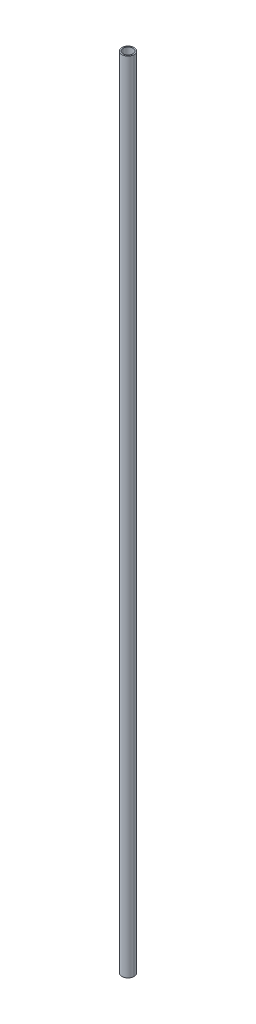
ISO-10303-21;
HEADER;
FILE_DESCRIPTION(('STEP AP214'),'2;1');
FILE_NAME('part.step','',(''),(''),'','','');
FILE_SCHEMA(('AUTOMOTIVE_DESIGN { 1 0 10303 214 1 1 1 1 }'));
ENDSEC;
DATA;
#1=APPLICATION_CONTEXT('core data for automotive mechanical design processes');
#2=APPLICATION_PROTOCOL_DEFINITION('international standard','automotive_design',2000,#1);
#3=PRODUCT_CONTEXT('',#1,'mechanical');
#4=PRODUCT('Part','Part','',(#3));
#5=PRODUCT_RELATED_PRODUCT_CATEGORY('part','',(#4));
#6=PRODUCT_DEFINITION_FORMATION('','',#4);
#7=PRODUCT_DEFINITION_CONTEXT('part definition',#1,'design');
#8=PRODUCT_DEFINITION('design','',#6,#7);
#9=PRODUCT_DEFINITION_SHAPE('','',#8);
#10=(LENGTH_UNIT() NAMED_UNIT(*) SI_UNIT(.MILLI.,.METRE.));
#11=(NAMED_UNIT(*) PLANE_ANGLE_UNIT() SI_UNIT($,.RADIAN.));
#12=(NAMED_UNIT(*) SI_UNIT($,.STERADIAN.) SOLID_ANGLE_UNIT());
#13=UNCERTAINTY_MEASURE_WITH_UNIT(LENGTH_MEASURE(1.E-05),#10,'distance_accuracy_value','');
#14=(GEOMETRIC_REPRESENTATION_CONTEXT(3) GLOBAL_UNCERTAINTY_ASSIGNED_CONTEXT((#13)) GLOBAL_UNIT_ASSIGNED_CONTEXT((#10,
#11,#12)) REPRESENTATION_CONTEXT('',''));
#15=CARTESIAN_POINT('',(0.,0.,0.));
#16=DIRECTION('',(0.,0.,1.));
#17=DIRECTION('',(1.,0.,0.));
#18=AXIS2_PLACEMENT_3D('',#15,#16,#17);
#19=CARTESIAN_POINT('',(0.,325.,0.));
#20=DIRECTION('',(0.,1.,0.));
#21=DIRECTION('',(-1.,0.,0.));
#22=AXIS2_PLACEMENT_3D('',#19,#20,#21);
#23=CYLINDRICAL_SURFACE('',#22,5.);
#24=DIRECTION('',(0.,1.,0.));
#25=VECTOR('',#24,1.);
#26=CARTESIAN_POINT('',(-5.,325.,0.));
#27=LINE('',#26,#25);
#28=CARTESIAN_POINT('',(-5.,0.,0.));
#29=VERTEX_POINT('',#28);
#30=CARTESIAN_POINT('',(-5.,650.,0.));
#31=VERTEX_POINT('',#30);
#32=EDGE_CURVE('E11',#29,#31,#27,.T.);
#33=ORIENTED_EDGE('',*,*,#32,.F.);
#34=CARTESIAN_POINT('',(0.,0.,0.));
#35=DIRECTION('',(0.,1.,0.));
#36=DIRECTION('',(1.,0.,0.));
#37=AXIS2_PLACEMENT_3D('',#34,#35,#36);
#38=CIRCLE('',#37,5.);
#39=CARTESIAN_POINT('',(5.,0.,0.));
#40=VERTEX_POINT('',#39);
#41=EDGE_CURVE('E100',#29,#40,#38,.T.);
#42=ORIENTED_EDGE('',*,*,#41,.T.);
#43=DIRECTION('',(0.,1.,0.));
#44=VECTOR('',#43,1.);
#45=CARTESIAN_POINT('',(5.,325.,0.));
#46=LINE('',#45,#44);
#47=CARTESIAN_POINT('',(5.,650.,0.));
#48=VERTEX_POINT('',#47);
#49=EDGE_CURVE('E28',#40,#48,#46,.T.);
#50=ORIENTED_EDGE('',*,*,#49,.T.);
#51=CARTESIAN_POINT('',(0.,650.,0.));
#52=DIRECTION('',(0.,1.,0.));
#53=DIRECTION('',(1.,0.,0.));
#54=AXIS2_PLACEMENT_3D('',#51,#52,#53);
#55=CIRCLE('',#54,5.);
#56=EDGE_CURVE('E21',#31,#48,#55,.T.);
#57=ORIENTED_EDGE('',*,*,#56,.F.);
#58=EDGE_LOOP('',(#33,#42,#50,#57));
#59=FACE_BOUND('',#58,.T.);
#60=ADVANCED_FACE('F17',(#59),#23,.T.);
#61=CARTESIAN_POINT('',(0.,325.,0.));
#62=DIRECTION('',(0.,1.,0.));
#63=DIRECTION('',(-1.,0.,0.));
#64=AXIS2_PLACEMENT_3D('',#61,#62,#63);
#65=CYLINDRICAL_SURFACE('',#64,5.);
#66=ORIENTED_EDGE('',*,*,#49,.F.);
#67=CARTESIAN_POINT('',(0.,0.,0.));
#68=DIRECTION('',(0.,1.,0.));
#69=DIRECTION('',(1.,0.,0.));
#70=AXIS2_PLACEMENT_3D('',#67,#68,#69);
#71=CIRCLE('',#70,5.);
#72=EDGE_CURVE('E83',#40,#29,#71,.T.);
#73=ORIENTED_EDGE('',*,*,#72,.T.);
#74=ORIENTED_EDGE('',*,*,#32,.T.);
#75=CARTESIAN_POINT('',(0.,650.,0.));
#76=DIRECTION('',(0.,1.,0.));
#77=DIRECTION('',(1.,0.,0.));
#78=AXIS2_PLACEMENT_3D('',#75,#76,#77);
#79=CIRCLE('',#78,5.);
#80=EDGE_CURVE('E87',#48,#31,#79,.T.);
#81=ORIENTED_EDGE('',*,*,#80,.F.);
#82=EDGE_LOOP('',(#66,#73,#74,#81));
#83=FACE_BOUND('',#82,.T.);
#84=ADVANCED_FACE('F120',(#83),#65,.T.);
#85=CARTESIAN_POINT('',(0.,325.,0.));
#86=DIRECTION('',(0.,1.,0.));
#87=DIRECTION('',(-1.,0.,0.));
#88=AXIS2_PLACEMENT_3D('',#85,#86,#87);
#89=CYLINDRICAL_SURFACE('',#88,4.);
#90=CARTESIAN_POINT('',(0.,650.,0.));
#91=DIRECTION('',(0.,1.,0.));
#92=DIRECTION('',(1.,0.,0.));
#93=AXIS2_PLACEMENT_3D('',#90,#91,#92);
#94=CIRCLE('',#93,4.);
#95=CARTESIAN_POINT('',(4.,650.,0.));
#96=VERTEX_POINT('',#95);
#97=CARTESIAN_POINT('',(-4.,650.,0.));
#98=VERTEX_POINT('',#97);
#99=EDGE_CURVE('E81',#96,#98,#94,.T.);
#100=ORIENTED_EDGE('',*,*,#99,.T.);
#101=DIRECTION('',(0.,1.,0.));
#102=VECTOR('',#101,1.);
#103=CARTESIAN_POINT('',(-4.,325.,0.));
#104=LINE('',#103,#102);
#105=CARTESIAN_POINT('',(-4.,0.,0.));
#106=VERTEX_POINT('',#105);
#107=EDGE_CURVE('E67',#106,#98,#104,.T.);
#108=ORIENTED_EDGE('',*,*,#107,.F.);
#109=CARTESIAN_POINT('',(0.,0.,0.));
#110=DIRECTION('',(0.,1.,0.));
#111=DIRECTION('',(1.,0.,0.));
#112=AXIS2_PLACEMENT_3D('',#109,#110,#111);
#113=CIRCLE('',#112,4.);
#114=CARTESIAN_POINT('',(4.,0.,0.));
#115=VERTEX_POINT('',#114);
#116=EDGE_CURVE('E95',#115,#106,#113,.T.);
#117=ORIENTED_EDGE('',*,*,#116,.F.);
#118=DIRECTION('',(0.,1.,0.));
#119=VECTOR('',#118,1.);
#120=CARTESIAN_POINT('',(4.,325.,0.));
#121=LINE('',#120,#119);
#122=EDGE_CURVE('E42',#115,#96,#121,.T.);
#123=ORIENTED_EDGE('',*,*,#122,.T.);
#124=EDGE_LOOP('',(#100,#108,#117,#123));
#125=FACE_BOUND('',#124,.T.);
#126=ADVANCED_FACE('F85',(#125),#89,.F.);
#127=CARTESIAN_POINT('',(0.,325.,0.));
#128=DIRECTION('',(0.,1.,0.));
#129=DIRECTION('',(-1.,0.,0.));
#130=AXIS2_PLACEMENT_3D('',#127,#128,#129);
#131=CYLINDRICAL_SURFACE('',#130,4.);
#132=CARTESIAN_POINT('',(0.,650.,0.));
#133=DIRECTION('',(0.,1.,0.));
#134=DIRECTION('',(1.,0.,0.));
#135=AXIS2_PLACEMENT_3D('',#132,#133,#134);
#136=CIRCLE('',#135,4.);
#137=EDGE_CURVE('E69',#98,#96,#136,.T.);
#138=ORIENTED_EDGE('',*,*,#137,.T.);
#139=ORIENTED_EDGE('',*,*,#122,.F.);
#140=CARTESIAN_POINT('',(0.,0.,0.));
#141=DIRECTION('',(0.,1.,0.));
#142=DIRECTION('',(1.,0.,0.));
#143=AXIS2_PLACEMENT_3D('',#140,#141,#142);
#144=CIRCLE('',#143,4.);
#145=EDGE_CURVE('E72',#106,#115,#144,.T.);
#146=ORIENTED_EDGE('',*,*,#145,.F.);
#147=ORIENTED_EDGE('',*,*,#107,.T.);
#148=EDGE_LOOP('',(#138,#139,#146,#147));
#149=FACE_BOUND('',#148,.T.);
#150=ADVANCED_FACE('F19',(#149),#131,.F.);
#151=CARTESIAN_POINT('',(0.,0.,0.));
#152=DIRECTION('',(0.,1.,0.));
#153=DIRECTION('',(1.,0.,0.));
#154=AXIS2_PLACEMENT_3D('',#151,#152,#153);
#155=PLANE('',#154);
#156=ORIENTED_EDGE('',*,*,#145,.T.);
#157=ORIENTED_EDGE('',*,*,#116,.T.);
#158=EDGE_LOOP('',(#156,#157));
#159=FACE_BOUND('',#158,.T.);
#160=ORIENTED_EDGE('',*,*,#72,.F.);
#161=ORIENTED_EDGE('',*,*,#41,.F.);
#162=EDGE_LOOP('',(#160,#161));
#163=FACE_BOUND('',#162,.T.);
#164=ADVANCED_FACE('F154',(#159,#163),#155,.F.);
#165=CARTESIAN_POINT('',(0.,650.,0.));
#166=DIRECTION('',(0.,1.,0.));
#167=DIRECTION('',(1.,0.,0.));
#168=AXIS2_PLACEMENT_3D('',#165,#166,#167);
#169=PLANE('',#168);
#170=ORIENTED_EDGE('',*,*,#99,.F.);
#171=ORIENTED_EDGE('',*,*,#137,.F.);
#172=EDGE_LOOP('',(#170,#171));
#173=FACE_BOUND('',#172,.T.);
#174=ORIENTED_EDGE('',*,*,#56,.T.);
#175=ORIENTED_EDGE('',*,*,#80,.T.);
#176=EDGE_LOOP('',(#174,#175));
#177=FACE_BOUND('',#176,.T.);
#178=ADVANCED_FACE('F79',(#173,#177),#169,.T.);
#179=CLOSED_SHELL('',(#60,#84,#126,#150,#164,#178));
#180=MANIFOLD_SOLID_BREP('B1',#179);
#181=ADVANCED_BREP_SHAPE_REPRESENTATION('',(#18,#180),#14);
#182=SHAPE_DEFINITION_REPRESENTATION(#9,#181);
ENDSEC;
END-ISO-10303-21;
